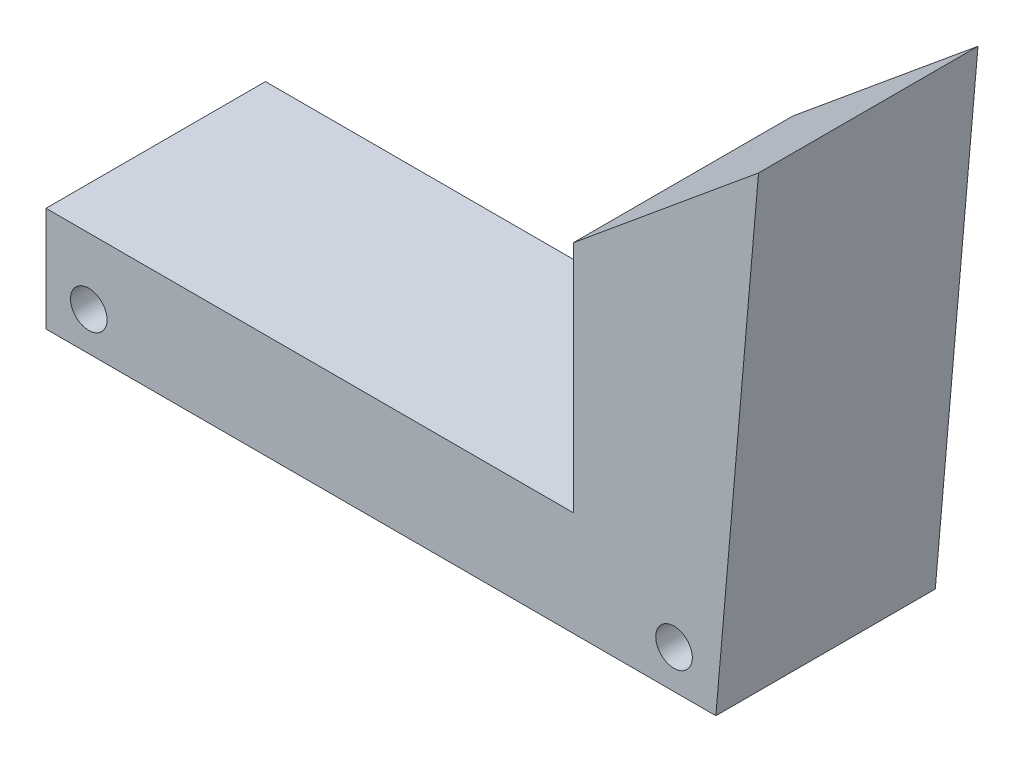
ISO-10303-21;
HEADER;
FILE_DESCRIPTION(('STEP AP214'),'2;1');
FILE_NAME('part.step','',(''),(''),'','','');
FILE_SCHEMA(('AUTOMOTIVE_DESIGN { 1 0 10303 214 1 1 1 1 }'));
ENDSEC;
DATA;
#1=APPLICATION_CONTEXT('core data for automotive mechanical design processes');
#2=APPLICATION_PROTOCOL_DEFINITION('international standard','automotive_design',2000,#1);
#3=PRODUCT_CONTEXT('',#1,'mechanical');
#4=PRODUCT('Part','Part','',(#3));
#5=PRODUCT_RELATED_PRODUCT_CATEGORY('part','',(#4));
#6=PRODUCT_DEFINITION_FORMATION('','',#4);
#7=PRODUCT_DEFINITION_CONTEXT('part definition',#1,'design');
#8=PRODUCT_DEFINITION('design','',#6,#7);
#9=PRODUCT_DEFINITION_SHAPE('','',#8);
#10=(LENGTH_UNIT() NAMED_UNIT(*) SI_UNIT(.MILLI.,.METRE.));
#11=(NAMED_UNIT(*) PLANE_ANGLE_UNIT() SI_UNIT($,.RADIAN.));
#12=(NAMED_UNIT(*) SI_UNIT($,.STERADIAN.) SOLID_ANGLE_UNIT());
#13=UNCERTAINTY_MEASURE_WITH_UNIT(LENGTH_MEASURE(1.E-05),#10,'distance_accuracy_value','');
#14=(GEOMETRIC_REPRESENTATION_CONTEXT(3) GLOBAL_UNCERTAINTY_ASSIGNED_CONTEXT((#13)) GLOBAL_UNIT_ASSIGNED_CONTEXT((#10,
#11,#12)) REPRESENTATION_CONTEXT('',''));
#15=CARTESIAN_POINT('',(0.,0.,0.));
#16=DIRECTION('',(0.,0.,1.));
#17=DIRECTION('',(1.,0.,0.));
#18=AXIS2_PLACEMENT_3D('',#15,#16,#17);
#19=CARTESIAN_POINT('',(0.,0.,38.1));
#20=DIRECTION('',(0.,0.,1.));
#21=DIRECTION('',(1.,0.,0.));
#22=AXIS2_PLACEMENT_3D('',#19,#20,#21);
#23=PLANE('',#22);
#24=CARTESIAN_POINT('',(-8.6342024112227,9.41242576369916,38.1));
#25=DIRECTION('',(0.,0.,1.));
#26=DIRECTION('',(1.,0.,0.));
#27=AXIS2_PLACEMENT_3D('',#24,#25,#26);
#28=CIRCLE('',#27,3.175);
#29=CARTESIAN_POINT('',(-11.8092024112227,9.41242576369916,38.1));
#30=VERTEX_POINT('',#29);
#31=EDGE_CURVE('E122',#30,#30,#28,.T.);
#32=ORIENTED_EDGE('',*,*,#31,.F.);
#33=EDGE_LOOP('',(#32));
#34=FACE_BOUND('',#33,.T.);
#35=DIRECTION('',(0.,-1.,0.));
#36=VECTOR('',#35,1.);
#37=CARTESIAN_POINT('',(-16.0566834566886,20.8869508199569,38.1));
#38=LINE('',#37,#36);
#39=CARTESIAN_POINT('',(-16.0566834566886,20.8869508199569,38.1));
#40=VERTEX_POINT('',#39);
#41=CARTESIAN_POINT('',(-16.0566834566886,2.73323678101946,38.1));
#42=VERTEX_POINT('',#41);
#43=EDGE_CURVE('E129',#40,#42,#38,.T.);
#44=ORIENTED_EDGE('',*,*,#43,.T.);
#45=DIRECTION('',(1.,0.,0.));
#46=VECTOR('',#45,1.);
#47=CARTESIAN_POINT('',(-16.0566834566886,2.73323678101946,38.1));
#48=LINE('',#47,#46);
#49=CARTESIAN_POINT('',(100.225653504437,2.73323678101946,38.1));
#50=VERTEX_POINT('',#49);
#51=EDGE_CURVE('E87',#42,#50,#48,.T.);
#52=ORIENTED_EDGE('',*,*,#51,.T.);
#53=DIRECTION('',(0.0865414180186874,0.996248253683446,0.));
#54=VECTOR('',#53,1.);
#55=CARTESIAN_POINT('',(100.225653504437,2.73323678101946,38.1));
#56=LINE('',#55,#54);
#57=CARTESIAN_POINT('',(107.63663241027,88.0470086379381,38.1));
#58=VERTEX_POINT('',#57);
#59=EDGE_CURVE('E100',#50,#58,#56,.T.);
#60=ORIENTED_EDGE('',*,*,#59,.T.);
#61=DIRECTION('',(-0.770934908319947,-0.636913940131408,0.));
#62=VECTOR('',#61,1.);
#63=CARTESIAN_POINT('',(107.63663241027,88.0470086379381,38.1));
#64=LINE('',#63,#62);
#65=CARTESIAN_POINT('',(75.4918935933118,61.4903797533799,38.1));
#66=VERTEX_POINT('',#65);
#67=EDGE_CURVE('E94',#58,#66,#64,.T.);
#68=ORIENTED_EDGE('',*,*,#67,.T.);
#69=DIRECTION('',(0.,-1.,0.));
#70=VECTOR('',#69,1.);
#71=CARTESIAN_POINT('',(75.4918935933118,61.4903797533799,38.1));
#72=LINE('',#71,#70);
#73=CARTESIAN_POINT('',(75.4918935933118,20.886950819957,38.1));
#74=VERTEX_POINT('',#73);
#75=EDGE_CURVE('E98',#66,#74,#72,.T.);
#76=ORIENTED_EDGE('',*,*,#75,.T.);
#77=DIRECTION('',(-1.,0.,0.));
#78=VECTOR('',#77,1.);
#79=CARTESIAN_POINT('',(75.4918935933118,20.886950819957,38.1));
#80=LINE('',#79,#78);
#81=EDGE_CURVE('E50',#74,#40,#80,.T.);
#82=ORIENTED_EDGE('',*,*,#81,.T.);
#83=EDGE_LOOP('',(#44,#52,#60,#68,#76,#82));
#84=FACE_BOUND('',#83,.T.);
#85=CARTESIAN_POINT('',(92.9657975887773,9.41242576369916,38.1));
#86=DIRECTION('',(0.,0.,1.));
#87=DIRECTION('',(1.,0.,0.));
#88=AXIS2_PLACEMENT_3D('',#85,#86,#87);
#89=CIRCLE('',#88,3.175);
#90=CARTESIAN_POINT('',(89.7907975887773,9.41242576369916,38.1));
#91=VERTEX_POINT('',#90);
#92=EDGE_CURVE('E171',#91,#91,#89,.T.);
#93=ORIENTED_EDGE('',*,*,#92,.F.);
#94=EDGE_LOOP('',(#93));
#95=FACE_BOUND('',#94,.T.);
#96=ADVANCED_FACE('F33',(#34,#84,#95),#23,.T.);
#97=CARTESIAN_POINT('',(0.,0.,0.));
#98=DIRECTION('',(0.,0.,1.));
#99=DIRECTION('',(1.,0.,0.));
#100=AXIS2_PLACEMENT_3D('',#97,#98,#99);
#101=PLANE('',#100);
#102=DIRECTION('',(0.,-1.,0.));
#103=VECTOR('',#102,1.);
#104=CARTESIAN_POINT('',(-16.0566834566886,20.8869508199569,0.));
#105=LINE('',#104,#103);
#106=CARTESIAN_POINT('',(-16.0566834566886,20.8869508199569,0.));
#107=VERTEX_POINT('',#106);
#108=CARTESIAN_POINT('',(-16.0566834566886,2.73323678101946,0.));
#109=VERTEX_POINT('',#108);
#110=EDGE_CURVE('E118',#107,#109,#105,.T.);
#111=ORIENTED_EDGE('',*,*,#110,.F.);
#112=DIRECTION('',(-1.,0.,0.));
#113=VECTOR('',#112,1.);
#114=CARTESIAN_POINT('',(75.4918935933118,20.886950819957,0.));
#115=LINE('',#114,#113);
#116=CARTESIAN_POINT('',(75.4918935933118,20.886950819957,0.));
#117=VERTEX_POINT('',#116);
#118=EDGE_CURVE('E79',#117,#107,#115,.T.);
#119=ORIENTED_EDGE('',*,*,#118,.F.);
#120=DIRECTION('',(0.,-1.,0.));
#121=VECTOR('',#120,1.);
#122=CARTESIAN_POINT('',(75.4918935933118,61.4903797533799,0.));
#123=LINE('',#122,#121);
#124=CARTESIAN_POINT('',(75.4918935933118,61.4903797533799,0.));
#125=VERTEX_POINT('',#124);
#126=EDGE_CURVE('E73',#125,#117,#123,.T.);
#127=ORIENTED_EDGE('',*,*,#126,.F.);
#128=DIRECTION('',(-0.770934908319947,-0.636913940131408,0.));
#129=VECTOR('',#128,1.);
#130=CARTESIAN_POINT('',(107.63663241027,88.0470086379381,0.));
#131=LINE('',#130,#129);
#132=CARTESIAN_POINT('',(107.63663241027,88.0470086379381,0.));
#133=VERTEX_POINT('',#132);
#134=EDGE_CURVE('E108',#133,#125,#131,.T.);
#135=ORIENTED_EDGE('',*,*,#134,.F.);
#136=DIRECTION('',(0.0865414180186874,0.996248253683446,0.));
#137=VECTOR('',#136,1.);
#138=CARTESIAN_POINT('',(100.225653504437,2.73323678101946,0.));
#139=LINE('',#138,#137);
#140=CARTESIAN_POINT('',(100.225653504437,2.73323678101946,0.));
#141=VERTEX_POINT('',#140);
#142=EDGE_CURVE('E124',#141,#133,#139,.T.);
#143=ORIENTED_EDGE('',*,*,#142,.F.);
#144=DIRECTION('',(1.,0.,0.));
#145=VECTOR('',#144,1.);
#146=CARTESIAN_POINT('',(-16.0566834566886,2.73323678101946,0.));
#147=LINE('',#146,#145);
#148=EDGE_CURVE('E121',#109,#141,#147,.T.);
#149=ORIENTED_EDGE('',*,*,#148,.F.);
#150=EDGE_LOOP('',(#111,#119,#127,#135,#143,#149));
#151=FACE_BOUND('',#150,.T.);
#152=CARTESIAN_POINT('',(-8.6342024112227,9.41242576369916,0.));
#153=DIRECTION('',(0.,0.,1.));
#154=DIRECTION('',(1.,0.,0.));
#155=AXIS2_PLACEMENT_3D('',#152,#153,#154);
#156=CIRCLE('',#155,3.175);
#157=CARTESIAN_POINT('',(-11.8092024112227,9.41242576369916,0.));
#158=VERTEX_POINT('',#157);
#159=EDGE_CURVE('E177',#158,#158,#156,.T.);
#160=ORIENTED_EDGE('',*,*,#159,.T.);
#161=EDGE_LOOP('',(#160));
#162=FACE_BOUND('',#161,.T.);
#163=CARTESIAN_POINT('',(92.9657975887773,9.41242576369916,0.));
#164=DIRECTION('',(0.,0.,1.));
#165=DIRECTION('',(1.,0.,0.));
#166=AXIS2_PLACEMENT_3D('',#163,#164,#165);
#167=CIRCLE('',#166,3.175);
#168=CARTESIAN_POINT('',(89.7907975887773,9.41242576369916,0.));
#169=VERTEX_POINT('',#168);
#170=EDGE_CURVE('E174',#169,#169,#167,.T.);
#171=ORIENTED_EDGE('',*,*,#170,.T.);
#172=EDGE_LOOP('',(#171));
#173=FACE_BOUND('',#172,.T.);
#174=ADVANCED_FACE('F138',(#151,#162,#173),#101,.F.);
#175=CARTESIAN_POINT('',(-16.0566834566886,20.8869508199569,38.1));
#176=DIRECTION('',(1.,0.,0.));
#177=DIRECTION('',(0.,1.,0.));
#178=AXIS2_PLACEMENT_3D('',#175,#176,#177);
#179=PLANE('',#178);
#180=ORIENTED_EDGE('',*,*,#110,.T.);
#181=DIRECTION('',(0.,0.,-1.));
#182=VECTOR('',#181,1.);
#183=CARTESIAN_POINT('',(-16.0566834566886,2.73323678101946,38.1));
#184=LINE('',#183,#182);
#185=EDGE_CURVE('E11',#42,#109,#184,.T.);
#186=ORIENTED_EDGE('',*,*,#185,.F.);
#187=ORIENTED_EDGE('',*,*,#43,.F.);
#188=DIRECTION('',(0.,0.,-1.));
#189=VECTOR('',#188,1.);
#190=CARTESIAN_POINT('',(-16.0566834566886,20.8869508199569,38.1));
#191=LINE('',#190,#189);
#192=EDGE_CURVE('E114',#40,#107,#191,.T.);
#193=ORIENTED_EDGE('',*,*,#192,.T.);
#194=EDGE_LOOP('',(#180,#186,#187,#193));
#195=FACE_BOUND('',#194,.T.);
#196=ADVANCED_FACE('F35',(#195),#179,.F.);
#197=CARTESIAN_POINT('',(-16.0566834566886,2.73323678101946,38.1));
#198=DIRECTION('',(0.,1.,0.));
#199=DIRECTION('',(-1.,0.,0.));
#200=AXIS2_PLACEMENT_3D('',#197,#198,#199);
#201=PLANE('',#200);
#202=ORIENTED_EDGE('',*,*,#148,.T.);
#203=DIRECTION('',(0.,0.,-1.));
#204=VECTOR('',#203,1.);
#205=CARTESIAN_POINT('',(100.225653504437,2.73323678101946,38.1));
#206=LINE('',#205,#204);
#207=EDGE_CURVE('E42',#50,#141,#206,.T.);
#208=ORIENTED_EDGE('',*,*,#207,.F.);
#209=ORIENTED_EDGE('',*,*,#51,.F.);
#210=ORIENTED_EDGE('',*,*,#185,.T.);
#211=EDGE_LOOP('',(#202,#208,#209,#210));
#212=FACE_BOUND('',#211,.T.);
#213=ADVANCED_FACE('F218',(#212),#201,.F.);
#214=CARTESIAN_POINT('',(100.225653504437,2.73323678101946,38.1));
#215=DIRECTION('',(-0.996248253683445,0.0865414180186874,0.));
#216=DIRECTION('',(-0.0865414180186874,-0.996248253683445,0.));
#217=AXIS2_PLACEMENT_3D('',#214,#215,#216);
#218=PLANE('',#217);
#219=ORIENTED_EDGE('',*,*,#142,.T.);
#220=DIRECTION('',(0.,0.,-1.));
#221=VECTOR('',#220,1.);
#222=CARTESIAN_POINT('',(107.63663241027,88.0470086379381,38.1));
#223=LINE('',#222,#221);
#224=EDGE_CURVE('E109',#58,#133,#223,.T.);
#225=ORIENTED_EDGE('',*,*,#224,.F.);
#226=ORIENTED_EDGE('',*,*,#59,.F.);
#227=ORIENTED_EDGE('',*,*,#207,.T.);
#228=EDGE_LOOP('',(#219,#225,#226,#227));
#229=FACE_BOUND('',#228,.T.);
#230=ADVANCED_FACE('F135',(#229),#218,.F.);
#231=CARTESIAN_POINT('',(107.63663241027,88.0470086379381,38.1));
#232=DIRECTION('',(0.636913940131408,-0.770934908319947,0.));
#233=DIRECTION('',(0.770934908319947,0.636913940131408,0.));
#234=AXIS2_PLACEMENT_3D('',#231,#232,#233);
#235=PLANE('',#234);
#236=ORIENTED_EDGE('',*,*,#134,.T.);
#237=DIRECTION('',(0.,0.,-1.));
#238=VECTOR('',#237,1.);
#239=CARTESIAN_POINT('',(75.4918935933118,61.4903797533799,38.1));
#240=LINE('',#239,#238);
#241=EDGE_CURVE('E105',#66,#125,#240,.T.);
#242=ORIENTED_EDGE('',*,*,#241,.F.);
#243=ORIENTED_EDGE('',*,*,#67,.F.);
#244=ORIENTED_EDGE('',*,*,#224,.T.);
#245=EDGE_LOOP('',(#236,#242,#243,#244));
#246=FACE_BOUND('',#245,.T.);
#247=ADVANCED_FACE('F106',(#246),#235,.F.);
#248=CARTESIAN_POINT('',(75.4918935933118,61.4903797533799,38.1));
#249=DIRECTION('',(1.,0.,0.));
#250=DIRECTION('',(0.,0.,-1.));
#251=AXIS2_PLACEMENT_3D('',#248,#249,#250);
#252=PLANE('',#251);
#253=ORIENTED_EDGE('',*,*,#126,.T.);
#254=DIRECTION('',(0.,0.,-1.));
#255=VECTOR('',#254,1.);
#256=CARTESIAN_POINT('',(75.4918935933118,20.886950819957,38.1));
#257=LINE('',#256,#255);
#258=EDGE_CURVE('E110',#74,#117,#257,.T.);
#259=ORIENTED_EDGE('',*,*,#258,.F.);
#260=ORIENTED_EDGE('',*,*,#75,.F.);
#261=ORIENTED_EDGE('',*,*,#241,.T.);
#262=EDGE_LOOP('',(#253,#259,#260,#261));
#263=FACE_BOUND('',#262,.T.);
#264=ADVANCED_FACE('F112',(#263),#252,.F.);
#265=CARTESIAN_POINT('',(75.4918935933118,20.886950819957,38.1));
#266=DIRECTION('',(0.,-1.,0.));
#267=DIRECTION('',(1.,0.,0.));
#268=AXIS2_PLACEMENT_3D('',#265,#266,#267);
#269=PLANE('',#268);
#270=ORIENTED_EDGE('',*,*,#118,.T.);
#271=ORIENTED_EDGE('',*,*,#192,.F.);
#272=ORIENTED_EDGE('',*,*,#81,.F.);
#273=ORIENTED_EDGE('',*,*,#258,.T.);
#274=EDGE_LOOP('',(#270,#271,#272,#273));
#275=FACE_BOUND('',#274,.T.);
#276=ADVANCED_FACE('F143',(#275),#269,.F.);
#277=CARTESIAN_POINT('',(-8.6342024112227,9.41242576369916,38.1));
#278=DIRECTION('',(0.,0.,-1.));
#279=DIRECTION('',(-1.,0.,0.));
#280=AXIS2_PLACEMENT_3D('',#277,#278,#279);
#281=CYLINDRICAL_SURFACE('',#280,3.175);
#282=CARTESIAN_POINT('',(-11.8092024112227,9.41242576369916,38.1));
#283=CARTESIAN_POINT('',(-11.8092024112227,9.41242576369916,37.703125));
#284=CARTESIAN_POINT('',(-11.8092024112227,9.41242576369916,37.30625));
#285=CARTESIAN_POINT('',(-11.8092024112227,9.41242576369916,36.5125));
#286=CARTESIAN_POINT('',(-11.8092024112227,9.41242576369916,36.115625));
#287=CARTESIAN_POINT('',(-11.8092024112227,9.41242576369916,35.321875));
#288=CARTESIAN_POINT('',(-11.8092024112227,9.41242576369916,34.925));
#289=CARTESIAN_POINT('',(-11.8092024112227,9.41242576369916,34.13125));
#290=CARTESIAN_POINT('',(-11.8092024112227,9.41242576369916,33.734375));
#291=CARTESIAN_POINT('',(-11.8092024112227,9.41242576369916,32.940625));
#292=CARTESIAN_POINT('',(-11.8092024112227,9.41242576369916,32.54375));
#293=CARTESIAN_POINT('',(-11.8092024112227,9.41242576369916,31.75));
#294=CARTESIAN_POINT('',(-11.8092024112227,9.41242576369916,31.353125));
#295=CARTESIAN_POINT('',(-11.8092024112227,9.41242576369916,30.559375));
#296=CARTESIAN_POINT('',(-11.8092024112227,9.41242576369916,30.1625));
#297=CARTESIAN_POINT('',(-11.8092024112227,9.41242576369916,29.36875));
#298=CARTESIAN_POINT('',(-11.8092024112227,9.41242576369916,28.971875));
#299=CARTESIAN_POINT('',(-11.8092024112227,9.41242576369916,28.178125));
#300=CARTESIAN_POINT('',(-11.8092024112227,9.41242576369916,27.78125));
#301=CARTESIAN_POINT('',(-11.8092024112227,9.41242576369916,26.9875));
#302=CARTESIAN_POINT('',(-11.8092024112227,9.41242576369916,26.590625));
#303=CARTESIAN_POINT('',(-11.8092024112227,9.41242576369916,25.796875));
#304=CARTESIAN_POINT('',(-11.8092024112227,9.41242576369916,25.4));
#305=CARTESIAN_POINT('',(-11.8092024112227,9.41242576369916,24.60625));
#306=CARTESIAN_POINT('',(-11.8092024112227,9.41242576369916,24.209375));
#307=CARTESIAN_POINT('',(-11.8092024112227,9.41242576369916,23.415625));
#308=CARTESIAN_POINT('',(-11.8092024112227,9.41242576369916,23.01875));
#309=CARTESIAN_POINT('',(-11.8092024112227,9.41242576369916,22.225));
#310=CARTESIAN_POINT('',(-11.8092024112227,9.41242576369916,21.828125));
#311=CARTESIAN_POINT('',(-11.8092024112227,9.41242576369916,21.034375));
#312=CARTESIAN_POINT('',(-11.8092024112227,9.41242576369916,20.6375));
#313=CARTESIAN_POINT('',(-11.8092024112227,9.41242576369916,19.84375));
#314=CARTESIAN_POINT('',(-11.8092024112227,9.41242576369916,19.446875));
#315=CARTESIAN_POINT('',(-11.8092024112227,9.41242576369916,18.653125));
#316=CARTESIAN_POINT('',(-11.8092024112227,9.41242576369916,18.25625));
#317=CARTESIAN_POINT('',(-11.8092024112227,9.41242576369916,17.4625));
#318=CARTESIAN_POINT('',(-11.8092024112227,9.41242576369916,17.065625));
#319=CARTESIAN_POINT('',(-11.8092024112227,9.41242576369916,16.271875));
#320=CARTESIAN_POINT('',(-11.8092024112227,9.41242576369916,15.875));
#321=CARTESIAN_POINT('',(-11.8092024112227,9.41242576369916,15.08125));
#322=CARTESIAN_POINT('',(-11.8092024112227,9.41242576369916,14.684375));
#323=CARTESIAN_POINT('',(-11.8092024112227,9.41242576369916,13.890625));
#324=CARTESIAN_POINT('',(-11.8092024112227,9.41242576369916,13.49375));
#325=CARTESIAN_POINT('',(-11.8092024112227,9.41242576369916,12.7));
#326=CARTESIAN_POINT('',(-11.8092024112227,9.41242576369916,12.303125));
#327=CARTESIAN_POINT('',(-11.8092024112227,9.41242576369916,11.509375));
#328=CARTESIAN_POINT('',(-11.8092024112227,9.41242576369916,11.1125));
#329=CARTESIAN_POINT('',(-11.8092024112227,9.41242576369916,10.31875));
#330=CARTESIAN_POINT('',(-11.8092024112227,9.41242576369916,9.921875));
#331=CARTESIAN_POINT('',(-11.8092024112227,9.41242576369916,9.128125));
#332=CARTESIAN_POINT('',(-11.8092024112227,9.41242576369916,8.73125));
#333=CARTESIAN_POINT('',(-11.8092024112227,9.41242576369916,7.9375));
#334=CARTESIAN_POINT('',(-11.8092024112227,9.41242576369916,7.540625));
#335=CARTESIAN_POINT('',(-11.8092024112227,9.41242576369916,6.746875));
#336=CARTESIAN_POINT('',(-11.8092024112227,9.41242576369916,6.35));
#337=CARTESIAN_POINT('',(-11.8092024112227,9.41242576369916,5.55625));
#338=CARTESIAN_POINT('',(-11.8092024112227,9.41242576369916,5.159375));
#339=CARTESIAN_POINT('',(-11.8092024112227,9.41242576369916,4.365625));
#340=CARTESIAN_POINT('',(-11.8092024112227,9.41242576369916,3.96875));
#341=CARTESIAN_POINT('',(-11.8092024112227,9.41242576369916,3.175));
#342=CARTESIAN_POINT('',(-11.8092024112227,9.41242576369916,2.778125));
#343=CARTESIAN_POINT('',(-11.8092024112227,9.41242576369916,1.984375));
#344=CARTESIAN_POINT('',(-11.8092024112227,9.41242576369916,1.5875));
#345=CARTESIAN_POINT('',(-11.8092024112227,9.41242576369916,0.79375));
#346=CARTESIAN_POINT('',(-11.8092024112227,9.41242576369916,0.396875));
#347=CARTESIAN_POINT('',(-11.8092024112227,9.41242576369916,0.));
#348=B_SPLINE_CURVE_WITH_KNOTS('',3,(#282,#283,#284,#285,#286,#287,#288,#289,#290,#291,#292,
#293,#294,#295,#296,#297,#298,#299,#300,#301,#302,#303,#304,#305,#306,#307,#308,#309,#310,#311,
#312,#313,#314,#315,#316,#317,#318,#319,#320,#321,#322,#323,#324,#325,#326,#327,#328,#329,#330,
#331,#332,#333,#334,#335,#336,#337,#338,#339,#340,#341,#342,#343,#344,#345,#346,#347),
.UNSPECIFIED.,.F.,.F.,(4,2,2,2,2,2,2,2,2,2,2,2,2,2,2,2,2,2,2,2,2,2,2,2,2,2,2,2,2,2,2,2,4),(0.,
1.19062499999999,2.38124999999999,3.571875,4.7625,5.953125,7.14375,8.33437499999999,9.525,
10.715625,11.90625,13.096875,14.2875,15.478125,16.66875,17.859375,19.05,20.240625,21.43125,
22.621875,23.8125,25.003125,26.19375,27.384375,28.575,29.765625,30.95625,32.146875,33.3375,
34.528125,35.71875,36.909375,38.1),.UNSPECIFIED.);
#349=EDGE_CURVE('BSEAM145',#30,#158,#348,.T.);
#350=ORIENTED_EDGE('',*,*,#31,.T.);
#351=ORIENTED_EDGE('',*,*,#159,.F.);
#352=ORIENTED_EDGE('',*,*,#349,.T.);
#353=ORIENTED_EDGE('',*,*,#349,.F.);
#354=EDGE_LOOP('',(#350,#352,#351,#353));
#355=FACE_BOUND('',#354,.T.);
#356=ADVANCED_FACE('F145',(#355),#281,.F.);
#357=CARTESIAN_POINT('',(92.9657975887773,9.41242576369916,38.1));
#358=DIRECTION('',(0.,0.,-1.));
#359=DIRECTION('',(-1.,0.,0.));
#360=AXIS2_PLACEMENT_3D('',#357,#358,#359);
#361=CYLINDRICAL_SURFACE('',#360,3.175);
#362=CARTESIAN_POINT('',(89.7907975887773,9.41242576369916,38.1));
#363=CARTESIAN_POINT('',(89.7907975887773,9.41242576369916,37.703125));
#364=CARTESIAN_POINT('',(89.7907975887773,9.41242576369916,37.30625));
#365=CARTESIAN_POINT('',(89.7907975887773,9.41242576369916,36.5125));
#366=CARTESIAN_POINT('',(89.7907975887773,9.41242576369916,36.115625));
#367=CARTESIAN_POINT('',(89.7907975887773,9.41242576369916,35.321875));
#368=CARTESIAN_POINT('',(89.7907975887773,9.41242576369916,34.925));
#369=CARTESIAN_POINT('',(89.7907975887773,9.41242576369916,34.13125));
#370=CARTESIAN_POINT('',(89.7907975887773,9.41242576369916,33.734375));
#371=CARTESIAN_POINT('',(89.7907975887773,9.41242576369916,32.940625));
#372=CARTESIAN_POINT('',(89.7907975887773,9.41242576369916,32.54375));
#373=CARTESIAN_POINT('',(89.7907975887773,9.41242576369916,31.75));
#374=CARTESIAN_POINT('',(89.7907975887773,9.41242576369916,31.353125));
#375=CARTESIAN_POINT('',(89.7907975887773,9.41242576369916,30.559375));
#376=CARTESIAN_POINT('',(89.7907975887773,9.41242576369916,30.1625));
#377=CARTESIAN_POINT('',(89.7907975887773,9.41242576369916,29.36875));
#378=CARTESIAN_POINT('',(89.7907975887773,9.41242576369916,28.971875));
#379=CARTESIAN_POINT('',(89.7907975887773,9.41242576369916,28.178125));
#380=CARTESIAN_POINT('',(89.7907975887773,9.41242576369916,27.78125));
#381=CARTESIAN_POINT('',(89.7907975887773,9.41242576369916,26.9875));
#382=CARTESIAN_POINT('',(89.7907975887773,9.41242576369916,26.590625));
#383=CARTESIAN_POINT('',(89.7907975887773,9.41242576369916,25.796875));
#384=CARTESIAN_POINT('',(89.7907975887773,9.41242576369916,25.4));
#385=CARTESIAN_POINT('',(89.7907975887773,9.41242576369916,24.60625));
#386=CARTESIAN_POINT('',(89.7907975887773,9.41242576369916,24.209375));
#387=CARTESIAN_POINT('',(89.7907975887773,9.41242576369916,23.415625));
#388=CARTESIAN_POINT('',(89.7907975887773,9.41242576369916,23.01875));
#389=CARTESIAN_POINT('',(89.7907975887773,9.41242576369916,22.225));
#390=CARTESIAN_POINT('',(89.7907975887773,9.41242576369916,21.828125));
#391=CARTESIAN_POINT('',(89.7907975887773,9.41242576369916,21.034375));
#392=CARTESIAN_POINT('',(89.7907975887773,9.41242576369916,20.6375));
#393=CARTESIAN_POINT('',(89.7907975887773,9.41242576369916,19.84375));
#394=CARTESIAN_POINT('',(89.7907975887773,9.41242576369916,19.446875));
#395=CARTESIAN_POINT('',(89.7907975887773,9.41242576369916,18.653125));
#396=CARTESIAN_POINT('',(89.7907975887773,9.41242576369916,18.25625));
#397=CARTESIAN_POINT('',(89.7907975887773,9.41242576369916,17.4625));
#398=CARTESIAN_POINT('',(89.7907975887773,9.41242576369916,17.065625));
#399=CARTESIAN_POINT('',(89.7907975887773,9.41242576369916,16.271875));
#400=CARTESIAN_POINT('',(89.7907975887773,9.41242576369916,15.875));
#401=CARTESIAN_POINT('',(89.7907975887773,9.41242576369916,15.08125));
#402=CARTESIAN_POINT('',(89.7907975887773,9.41242576369916,14.684375));
#403=CARTESIAN_POINT('',(89.7907975887773,9.41242576369916,13.890625));
#404=CARTESIAN_POINT('',(89.7907975887773,9.41242576369916,13.49375));
#405=CARTESIAN_POINT('',(89.7907975887773,9.41242576369916,12.7));
#406=CARTESIAN_POINT('',(89.7907975887773,9.41242576369916,12.303125));
#407=CARTESIAN_POINT('',(89.7907975887773,9.41242576369916,11.509375));
#408=CARTESIAN_POINT('',(89.7907975887773,9.41242576369916,11.1125));
#409=CARTESIAN_POINT('',(89.7907975887773,9.41242576369916,10.31875));
#410=CARTESIAN_POINT('',(89.7907975887773,9.41242576369916,9.921875));
#411=CARTESIAN_POINT('',(89.7907975887773,9.41242576369916,9.128125));
#412=CARTESIAN_POINT('',(89.7907975887773,9.41242576369916,8.73125));
#413=CARTESIAN_POINT('',(89.7907975887773,9.41242576369916,7.9375));
#414=CARTESIAN_POINT('',(89.7907975887773,9.41242576369916,7.540625));
#415=CARTESIAN_POINT('',(89.7907975887773,9.41242576369916,6.746875));
#416=CARTESIAN_POINT('',(89.7907975887773,9.41242576369916,6.35));
#417=CARTESIAN_POINT('',(89.7907975887773,9.41242576369916,5.55625));
#418=CARTESIAN_POINT('',(89.7907975887773,9.41242576369916,5.159375));
#419=CARTESIAN_POINT('',(89.7907975887773,9.41242576369916,4.365625));
#420=CARTESIAN_POINT('',(89.7907975887773,9.41242576369916,3.96875));
#421=CARTESIAN_POINT('',(89.7907975887773,9.41242576369916,3.175));
#422=CARTESIAN_POINT('',(89.7907975887773,9.41242576369916,2.778125));
#423=CARTESIAN_POINT('',(89.7907975887773,9.41242576369916,1.984375));
#424=CARTESIAN_POINT('',(89.7907975887773,9.41242576369916,1.5875));
#425=CARTESIAN_POINT('',(89.7907975887773,9.41242576369916,0.79375));
#426=CARTESIAN_POINT('',(89.7907975887773,9.41242576369916,0.396875));
#427=CARTESIAN_POINT('',(89.7907975887773,9.41242576369916,0.));
#428=B_SPLINE_CURVE_WITH_KNOTS('',3,(#362,#363,#364,#365,#366,#367,#368,#369,#370,#371,#372,
#373,#374,#375,#376,#377,#378,#379,#380,#381,#382,#383,#384,#385,#386,#387,#388,#389,#390,#391,
#392,#393,#394,#395,#396,#397,#398,#399,#400,#401,#402,#403,#404,#405,#406,#407,#408,#409,#410,
#411,#412,#413,#414,#415,#416,#417,#418,#419,#420,#421,#422,#423,#424,#425,#426,#427),
.UNSPECIFIED.,.F.,.F.,(4,2,2,2,2,2,2,2,2,2,2,2,2,2,2,2,2,2,2,2,2,2,2,2,2,2,2,2,2,2,2,2,4),(0.,
1.19062499999999,2.38124999999999,3.571875,4.7625,5.953125,7.14375,8.33437499999999,9.525,
10.715625,11.90625,13.096875,14.2875,15.478125,16.66875,17.859375,19.05,20.240625,21.43125,
22.621875,23.8125,25.003125,26.19375,27.384375,28.575,29.765625,30.95625,32.146875,33.3375,
34.528125,35.71875,36.909375,38.1),.UNSPECIFIED.);
#429=EDGE_CURVE('BSEAM151',#91,#169,#428,.T.);
#430=ORIENTED_EDGE('',*,*,#92,.T.);
#431=ORIENTED_EDGE('',*,*,#170,.F.);
#432=ORIENTED_EDGE('',*,*,#429,.T.);
#433=ORIENTED_EDGE('',*,*,#429,.F.);
#434=EDGE_LOOP('',(#430,#432,#431,#433));
#435=FACE_BOUND('',#434,.T.);
#436=ADVANCED_FACE('F151',(#435),#361,.F.);
#437=CLOSED_SHELL('',(#96,#174,#196,#213,#230,#247,#264,#276,#356,#436));
#438=MANIFOLD_SOLID_BREP('B2',#437);
#439=ADVANCED_BREP_SHAPE_REPRESENTATION('',(#18,#438),#14);
#440=SHAPE_DEFINITION_REPRESENTATION(#9,#439);
ENDSEC;
END-ISO-10303-21;
